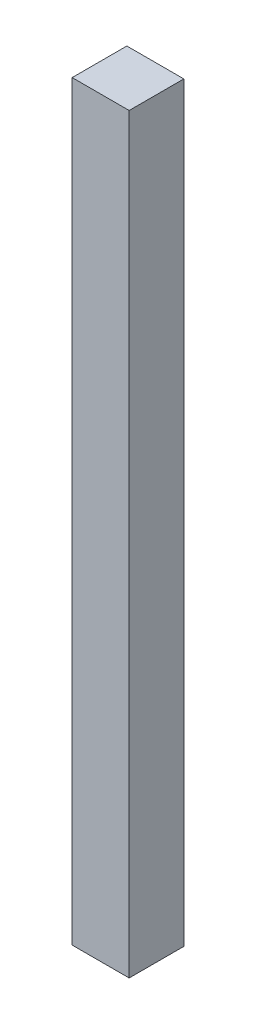
ISO-10303-21;
HEADER;
FILE_DESCRIPTION(('STEP AP214'),'2;1');
FILE_NAME('part.step','',(''),(''),'','','');
FILE_SCHEMA(('AUTOMOTIVE_DESIGN { 1 0 10303 214 1 1 1 1 }'));
ENDSEC;
DATA;
#1=APPLICATION_CONTEXT('core data for automotive mechanical design processes');
#2=APPLICATION_PROTOCOL_DEFINITION('international standard','automotive_design',2000,#1);
#3=PRODUCT_CONTEXT('',#1,'mechanical');
#4=PRODUCT('Part','Part','',(#3));
#5=PRODUCT_RELATED_PRODUCT_CATEGORY('part','',(#4));
#6=PRODUCT_DEFINITION_FORMATION('','',#4);
#7=PRODUCT_DEFINITION_CONTEXT('part definition',#1,'design');
#8=PRODUCT_DEFINITION('design','',#6,#7);
#9=PRODUCT_DEFINITION_SHAPE('','',#8);
#10=(LENGTH_UNIT() NAMED_UNIT(*) SI_UNIT(.MILLI.,.METRE.));
#11=(NAMED_UNIT(*) PLANE_ANGLE_UNIT() SI_UNIT($,.RADIAN.));
#12=(NAMED_UNIT(*) SI_UNIT($,.STERADIAN.) SOLID_ANGLE_UNIT());
#13=UNCERTAINTY_MEASURE_WITH_UNIT(LENGTH_MEASURE(1.E-05),#10,'distance_accuracy_value','');
#14=(GEOMETRIC_REPRESENTATION_CONTEXT(3) GLOBAL_UNCERTAINTY_ASSIGNED_CONTEXT((#13)) GLOBAL_UNIT_ASSIGNED_CONTEXT((#10,
#11,#12)) REPRESENTATION_CONTEXT('',''));
#15=CARTESIAN_POINT('',(0.,0.,0.));
#16=DIRECTION('',(0.,0.,1.));
#17=DIRECTION('',(1.,0.,0.));
#18=AXIS2_PLACEMENT_3D('',#15,#16,#17);
#19=CARTESIAN_POINT('',(0.,215.9,0.));
#20=DIRECTION('',(1.,0.,0.));
#21=DIRECTION('',(0.,0.,-1.));
#22=AXIS2_PLACEMENT_3D('',#19,#20,#21);
#23=PLANE('',#22);
#24=DIRECTION('',(0.,0.,1.));
#25=VECTOR('',#24,1.);
#26=CARTESIAN_POINT('',(0.,0.,0.));
#27=LINE('',#26,#25);
#28=CARTESIAN_POINT('',(0.,0.,-15.7156849626676));
#29=VERTEX_POINT('',#28);
#30=CARTESIAN_POINT('',(0.,0.,0.));
#31=VERTEX_POINT('',#30);
#32=EDGE_CURVE('E107',#29,#31,#27,.T.);
#33=ORIENTED_EDGE('',*,*,#32,.T.);
#34=DIRECTION('',(0.,-1.,0.));
#35=VECTOR('',#34,1.);
#36=CARTESIAN_POINT('',(0.,215.9,0.));
#37=LINE('',#36,#35);
#38=CARTESIAN_POINT('',(0.,215.9,0.));
#39=VERTEX_POINT('',#38);
#40=EDGE_CURVE('E11',#39,#31,#37,.T.);
#41=ORIENTED_EDGE('',*,*,#40,.F.);
#42=DIRECTION('',(0.,0.,1.));
#43=VECTOR('',#42,1.);
#44=CARTESIAN_POINT('',(0.,215.9,0.));
#45=LINE('',#44,#43);
#46=CARTESIAN_POINT('',(0.,215.9,-15.7156849626676));
#47=VERTEX_POINT('',#46);
#48=EDGE_CURVE('E91',#47,#39,#45,.T.);
#49=ORIENTED_EDGE('',*,*,#48,.F.);
#50=DIRECTION('',(0.,-1.,0.));
#51=VECTOR('',#50,1.);
#52=CARTESIAN_POINT('',(0.,215.9,-15.7156849626676));
#53=LINE('',#52,#51);
#54=EDGE_CURVE('E103',#47,#29,#53,.T.);
#55=ORIENTED_EDGE('',*,*,#54,.T.);
#56=EDGE_LOOP('',(#33,#41,#49,#55));
#57=FACE_BOUND('',#56,.T.);
#58=ADVANCED_FACE('F39',(#57),#23,.F.);
#59=CARTESIAN_POINT('',(0.,215.9,0.));
#60=DIRECTION('',(0.,0.,-1.));
#61=DIRECTION('',(-1.,0.,0.));
#62=AXIS2_PLACEMENT_3D('',#59,#60,#61);
#63=PLANE('',#62);
#64=DIRECTION('',(1.,0.,0.));
#65=VECTOR('',#64,1.);
#66=CARTESIAN_POINT('',(0.,0.,0.));
#67=LINE('',#66,#65);
#68=CARTESIAN_POINT('',(16.3760078602587,0.,0.));
#69=VERTEX_POINT('',#68);
#70=EDGE_CURVE('E96',#31,#69,#67,.T.);
#71=ORIENTED_EDGE('',*,*,#70,.T.);
#72=DIRECTION('',(0.,-1.,0.));
#73=VECTOR('',#72,1.);
#74=CARTESIAN_POINT('',(16.3760078602587,215.9,0.));
#75=LINE('',#74,#73);
#76=CARTESIAN_POINT('',(16.3760078602587,215.9,0.));
#77=VERTEX_POINT('',#76);
#78=EDGE_CURVE('E48',#77,#69,#75,.T.);
#79=ORIENTED_EDGE('',*,*,#78,.F.);
#80=DIRECTION('',(1.,0.,0.));
#81=VECTOR('',#80,1.);
#82=CARTESIAN_POINT('',(0.,215.9,0.));
#83=LINE('',#82,#81);
#84=EDGE_CURVE('E86',#39,#77,#83,.T.);
#85=ORIENTED_EDGE('',*,*,#84,.F.);
#86=ORIENTED_EDGE('',*,*,#40,.T.);
#87=EDGE_LOOP('',(#71,#79,#85,#86));
#88=FACE_BOUND('',#87,.T.);
#89=ADVANCED_FACE('F95',(#88),#63,.F.);
#90=CARTESIAN_POINT('',(16.3760078602587,215.9,0.));
#91=DIRECTION('',(-1.,0.,0.));
#92=DIRECTION('',(0.,0.,1.));
#93=AXIS2_PLACEMENT_3D('',#90,#91,#92);
#94=PLANE('',#93);
#95=DIRECTION('',(0.,0.,-1.));
#96=VECTOR('',#95,1.);
#97=CARTESIAN_POINT('',(16.3760078602587,0.,0.));
#98=LINE('',#97,#96);
#99=CARTESIAN_POINT('',(16.3760078602587,0.,-15.7156849626676));
#100=VERTEX_POINT('',#99);
#101=EDGE_CURVE('E73',#69,#100,#98,.T.);
#102=ORIENTED_EDGE('',*,*,#101,.T.);
#103=DIRECTION('',(0.,-1.,0.));
#104=VECTOR('',#103,1.);
#105=CARTESIAN_POINT('',(16.3760078602587,215.9,-15.7156849626676));
#106=LINE('',#105,#104);
#107=CARTESIAN_POINT('',(16.3760078602587,215.9,-15.7156849626676));
#108=VERTEX_POINT('',#107);
#109=EDGE_CURVE('E98',#108,#100,#106,.T.);
#110=ORIENTED_EDGE('',*,*,#109,.F.);
#111=DIRECTION('',(0.,0.,-1.));
#112=VECTOR('',#111,1.);
#113=CARTESIAN_POINT('',(16.3760078602587,215.9,0.));
#114=LINE('',#113,#112);
#115=EDGE_CURVE('E89',#77,#108,#114,.T.);
#116=ORIENTED_EDGE('',*,*,#115,.F.);
#117=ORIENTED_EDGE('',*,*,#78,.T.);
#118=EDGE_LOOP('',(#102,#110,#116,#117));
#119=FACE_BOUND('',#118,.T.);
#120=ADVANCED_FACE('F99',(#119),#94,.F.);
#121=CARTESIAN_POINT('',(0.,215.9,-15.7156849626676));
#122=DIRECTION('',(0.,0.,1.));
#123=DIRECTION('',(1.,0.,0.));
#124=AXIS2_PLACEMENT_3D('',#121,#122,#123);
#125=PLANE('',#124);
#126=DIRECTION('',(-1.,0.,0.));
#127=VECTOR('',#126,1.);
#128=CARTESIAN_POINT('',(0.,0.,-15.7156849626676));
#129=LINE('',#128,#127);
#130=EDGE_CURVE('E79',#100,#29,#129,.T.);
#131=ORIENTED_EDGE('',*,*,#130,.T.);
#132=ORIENTED_EDGE('',*,*,#54,.F.);
#133=DIRECTION('',(-1.,0.,0.));
#134=VECTOR('',#133,1.);
#135=CARTESIAN_POINT('',(0.,215.9,-15.7156849626676));
#136=LINE('',#135,#134);
#137=EDGE_CURVE('E56',#108,#47,#136,.T.);
#138=ORIENTED_EDGE('',*,*,#137,.F.);
#139=ORIENTED_EDGE('',*,*,#109,.T.);
#140=EDGE_LOOP('',(#131,#132,#138,#139));
#141=FACE_BOUND('',#140,.T.);
#142=ADVANCED_FACE('F120',(#141),#125,.F.);
#143=CARTESIAN_POINT('',(0.,215.9,0.));
#144=DIRECTION('',(0.,-1.,0.));
#145=DIRECTION('',(0.,0.,-1.));
#146=AXIS2_PLACEMENT_3D('',#143,#144,#145);
#147=PLANE('',#146);
#148=ORIENTED_EDGE('',*,*,#48,.T.);
#149=ORIENTED_EDGE('',*,*,#84,.T.);
#150=ORIENTED_EDGE('',*,*,#115,.T.);
#151=ORIENTED_EDGE('',*,*,#137,.T.);
#152=EDGE_LOOP('',(#148,#149,#150,#151));
#153=FACE_BOUND('',#152,.T.);
#154=ADVANCED_FACE('F87',(#153),#147,.F.);
#155=CARTESIAN_POINT('',(0.,0.,0.));
#156=DIRECTION('',(0.,-1.,0.));
#157=DIRECTION('',(0.,0.,-1.));
#158=AXIS2_PLACEMENT_3D('',#155,#156,#157);
#159=PLANE('',#158);
#160=ORIENTED_EDGE('',*,*,#32,.F.);
#161=ORIENTED_EDGE('',*,*,#130,.F.);
#162=ORIENTED_EDGE('',*,*,#101,.F.);
#163=ORIENTED_EDGE('',*,*,#70,.F.);
#164=EDGE_LOOP('',(#160,#161,#162,#163));
#165=FACE_BOUND('',#164,.T.);
#166=ADVANCED_FACE('F123',(#165),#159,.T.);
#167=CLOSED_SHELL('',(#58,#89,#120,#142,#154,#166));
#168=MANIFOLD_SOLID_BREP('B2',#167);
#169=ADVANCED_BREP_SHAPE_REPRESENTATION('',(#18,#168),#14);
#170=SHAPE_DEFINITION_REPRESENTATION(#9,#169);
ENDSEC;
END-ISO-10303-21;
